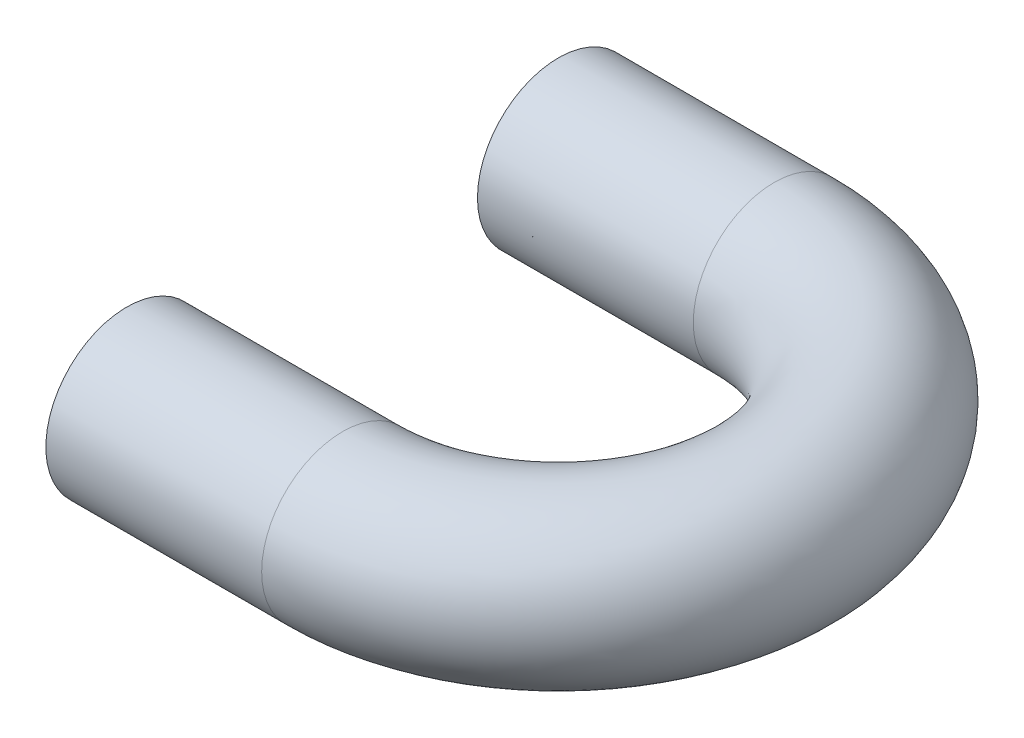
ISO-10303-21;
HEADER;
FILE_DESCRIPTION(('STEP AP214'),'2;1');
FILE_NAME('part.step','',(''),(''),'','','');
FILE_SCHEMA(('AUTOMOTIVE_DESIGN { 1 0 10303 214 1 1 1 1 }'));
ENDSEC;
DATA;
#1=APPLICATION_CONTEXT('core data for automotive mechanical design processes');
#2=APPLICATION_PROTOCOL_DEFINITION('international standard','automotive_design',2000,#1);
#3=PRODUCT_CONTEXT('',#1,'mechanical');
#4=PRODUCT('Part','Part','',(#3));
#5=PRODUCT_RELATED_PRODUCT_CATEGORY('part','',(#4));
#6=PRODUCT_DEFINITION_FORMATION('','',#4);
#7=PRODUCT_DEFINITION_CONTEXT('part definition',#1,'design');
#8=PRODUCT_DEFINITION('design','',#6,#7);
#9=PRODUCT_DEFINITION_SHAPE('','',#8);
#10=(LENGTH_UNIT() NAMED_UNIT(*) SI_UNIT(.MILLI.,.METRE.));
#11=(NAMED_UNIT(*) PLANE_ANGLE_UNIT() SI_UNIT($,.RADIAN.));
#12=(NAMED_UNIT(*) SI_UNIT($,.STERADIAN.) SOLID_ANGLE_UNIT());
#13=UNCERTAINTY_MEASURE_WITH_UNIT(LENGTH_MEASURE(1.E-05),#10,'distance_accuracy_value','');
#14=(GEOMETRIC_REPRESENTATION_CONTEXT(3) GLOBAL_UNCERTAINTY_ASSIGNED_CONTEXT((#13)) GLOBAL_UNIT_ASSIGNED_CONTEXT((#10,
#11,#12)) REPRESENTATION_CONTEXT('',''));
#15=CARTESIAN_POINT('',(0.,0.,0.));
#16=DIRECTION('',(0.,0.,1.));
#17=DIRECTION('',(1.,0.,0.));
#18=AXIS2_PLACEMENT_3D('',#15,#16,#17);
#19=CARTESIAN_POINT('',(0.,0.,0.));
#20=DIRECTION('',(1.,0.,0.));
#21=DIRECTION('',(0.,0.,-1.));
#22=AXIS2_PLACEMENT_3D('',#19,#20,#21);
#23=CYLINDRICAL_SURFACE('',#22,7.5);
#24=CARTESIAN_POINT('',(20.,0.,0.));
#25=DIRECTION('',(1.,0.,0.));
#26=DIRECTION('',(0.,0.,-1.));
#27=AXIS2_PLACEMENT_3D('',#24,#25,#26);
#28=CIRCLE('',#27,7.5);
#29=CARTESIAN_POINT('',(20.,0.,7.5));
#30=VERTEX_POINT('',#29);
#31=EDGE_CURVE('E80',#30,#30,#28,.T.);
#32=ORIENTED_EDGE('',*,*,#31,.F.);
#33=EDGE_LOOP('',(#32));
#34=FACE_BOUND('',#33,.T.);
#35=CARTESIAN_POINT('',(0.,0.,0.));
#36=DIRECTION('',(1.,0.,0.));
#37=DIRECTION('',(0.,0.,-1.));
#38=AXIS2_PLACEMENT_3D('',#35,#36,#37);
#39=CIRCLE('',#38,7.5);
#40=CARTESIAN_POINT('',(0.,0.,-7.5));
#41=VERTEX_POINT('',#40);
#42=EDGE_CURVE('E49',#41,#41,#39,.T.);
#43=ORIENTED_EDGE('',*,*,#42,.T.);
#44=EDGE_LOOP('',(#43));
#45=FACE_BOUND('',#44,.T.);
#46=ADVANCED_FACE('F34',(#34,#45),#23,.T.);
#47=CARTESIAN_POINT('',(20.,0.,-20.));
#48=DIRECTION('',(0.,1.,0.));
#49=DIRECTION('',(0.,0.,1.));
#50=AXIS2_PLACEMENT_3D('',#47,#48,#49);
#51=TOROIDAL_SURFACE('',#50,20.,7.5);
#52=CARTESIAN_POINT('',(20.,0.,-40.));
#53=DIRECTION('',(-1.,0.,0.));
#54=DIRECTION('',(0.,0.,1.));
#55=AXIS2_PLACEMENT_3D('',#52,#53,#54);
#56=CIRCLE('',#55,7.5);
#57=CARTESIAN_POINT('',(20.,0.,-47.5));
#58=VERTEX_POINT('',#57);
#59=EDGE_CURVE('E38',#58,#58,#56,.T.);
#60=CARTESIAN_POINT('',(20.,0.,-20.));
#61=DIRECTION('',(0.,1.,0.));
#62=DIRECTION('',(0.,0.,1.));
#63=AXIS2_PLACEMENT_3D('',#60,#61,#62);
#64=CIRCLE('',#63,27.5);
#65=EDGE_CURVE('',#30,#58,#64,.T.);
#66=ORIENTED_EDGE('',*,*,#31,.T.);
#67=ORIENTED_EDGE('',*,*,#59,.F.);
#68=ORIENTED_EDGE('',*,*,#65,.T.);
#69=ORIENTED_EDGE('',*,*,#65,.F.);
#70=EDGE_LOOP('',(#66,#68,#67,#69));
#71=FACE_BOUND('',#70,.T.);
#72=ADVANCED_FACE('F88',(#71),#51,.T.);
#73=CARTESIAN_POINT('',(20.,0.,-40.));
#74=DIRECTION('',(-1.,0.,0.));
#75=DIRECTION('',(0.,0.,1.));
#76=AXIS2_PLACEMENT_3D('',#73,#74,#75);
#77=CYLINDRICAL_SURFACE('',#76,7.5);
#78=CARTESIAN_POINT('',(0.,0.,-40.));
#79=DIRECTION('',(-1.,0.,0.));
#80=DIRECTION('',(0.,0.,1.));
#81=AXIS2_PLACEMENT_3D('',#78,#79,#80);
#82=CIRCLE('',#81,7.5);
#83=CARTESIAN_POINT('',(0.,0.,-32.5));
#84=VERTEX_POINT('',#83);
#85=EDGE_CURVE('E54',#84,#84,#82,.T.);
#86=ORIENTED_EDGE('',*,*,#85,.F.);
#87=EDGE_LOOP('',(#86));
#88=FACE_BOUND('',#87,.T.);
#89=ORIENTED_EDGE('',*,*,#59,.T.);
#90=EDGE_LOOP('',(#89));
#91=FACE_BOUND('',#90,.T.);
#92=ADVANCED_FACE('F36',(#88,#91),#77,.T.);
#93=CARTESIAN_POINT('',(0.,0.,0.));
#94=DIRECTION('',(1.,0.,0.));
#95=DIRECTION('',(0.,0.,-1.));
#96=AXIS2_PLACEMENT_3D('',#93,#94,#95);
#97=PLANE('',#96);
#98=CARTESIAN_POINT('',(0.,0.,0.));
#99=DIRECTION('',(1.,0.,0.));
#100=DIRECTION('',(0.,0.,-1.));
#101=AXIS2_PLACEMENT_3D('',#98,#99,#100);
#102=CIRCLE('',#101,5.7);
#103=CARTESIAN_POINT('',(0.,0.,-5.7));
#104=VERTEX_POINT('',#103);
#105=EDGE_CURVE('E75',#104,#104,#102,.F.);
#106=ORIENTED_EDGE('',*,*,#105,.F.);
#107=EDGE_LOOP('',(#106));
#108=FACE_BOUND('',#107,.T.);
#109=ORIENTED_EDGE('',*,*,#42,.F.);
#110=EDGE_LOOP('',(#109));
#111=FACE_BOUND('',#110,.T.);
#112=ADVANCED_FACE('F94',(#108,#111),#97,.F.);
#113=CARTESIAN_POINT('',(0.,0.,-40.));
#114=DIRECTION('',(-1.,0.,0.));
#115=DIRECTION('',(0.,0.,1.));
#116=AXIS2_PLACEMENT_3D('',#113,#114,#115);
#117=PLANE('',#116);
#118=CARTESIAN_POINT('',(0.,0.,-40.));
#119=DIRECTION('',(-1.,0.,0.));
#120=DIRECTION('',(0.,0.,1.));
#121=AXIS2_PLACEMENT_3D('',#118,#119,#120);
#122=CIRCLE('',#121,5.7);
#123=CARTESIAN_POINT('',(0.,0.,-34.3));
#124=VERTEX_POINT('',#123);
#125=EDGE_CURVE('E11',#124,#124,#122,.F.);
#126=ORIENTED_EDGE('',*,*,#125,.T.);
#127=EDGE_LOOP('',(#126));
#128=FACE_BOUND('',#127,.T.);
#129=ORIENTED_EDGE('',*,*,#85,.T.);
#130=EDGE_LOOP('',(#129));
#131=FACE_BOUND('',#130,.T.);
#132=ADVANCED_FACE('F61',(#128,#131),#117,.T.);
#133=CARTESIAN_POINT('',(0.,0.,0.));
#134=DIRECTION('',(1.,0.,0.));
#135=DIRECTION('',(0.,0.,-1.));
#136=AXIS2_PLACEMENT_3D('',#133,#134,#135);
#137=CYLINDRICAL_SURFACE('',#136,5.7);
#138=CARTESIAN_POINT('',(20.,0.,0.));
#139=DIRECTION('',(1.,0.,0.));
#140=DIRECTION('',(0.,0.,-1.));
#141=AXIS2_PLACEMENT_3D('',#138,#139,#140);
#142=CIRCLE('',#141,5.7);
#143=CARTESIAN_POINT('',(20.,0.,5.7));
#144=VERTEX_POINT('',#143);
#145=EDGE_CURVE('E72',#144,#144,#142,.F.);
#146=ORIENTED_EDGE('',*,*,#145,.F.);
#147=EDGE_LOOP('',(#146));
#148=FACE_BOUND('',#147,.T.);
#149=ORIENTED_EDGE('',*,*,#105,.T.);
#150=EDGE_LOOP('',(#149));
#151=FACE_BOUND('',#150,.T.);
#152=ADVANCED_FACE('F102',(#148,#151),#137,.F.);
#153=CARTESIAN_POINT('',(20.,0.,-20.));
#154=DIRECTION('',(0.,1.,0.));
#155=DIRECTION('',(0.,0.,1.));
#156=AXIS2_PLACEMENT_3D('',#153,#154,#155);
#157=TOROIDAL_SURFACE('',#156,20.,5.7);
#158=CARTESIAN_POINT('',(20.,0.,-40.));
#159=DIRECTION('',(-1.,0.,0.));
#160=DIRECTION('',(0.,0.,1.));
#161=AXIS2_PLACEMENT_3D('',#158,#159,#160);
#162=CIRCLE('',#161,5.7);
#163=CARTESIAN_POINT('',(20.,0.,-45.7));
#164=VERTEX_POINT('',#163);
#165=EDGE_CURVE('E43',#164,#164,#162,.F.);
#166=CARTESIAN_POINT('',(20.,0.,-20.));
#167=DIRECTION('',(0.,1.,0.));
#168=DIRECTION('',(0.,0.,1.));
#169=AXIS2_PLACEMENT_3D('',#166,#167,#168);
#170=CIRCLE('',#169,25.7);
#171=EDGE_CURVE('',#144,#164,#170,.T.);
#172=ORIENTED_EDGE('',*,*,#145,.T.);
#173=ORIENTED_EDGE('',*,*,#165,.F.);
#174=ORIENTED_EDGE('',*,*,#171,.T.);
#175=ORIENTED_EDGE('',*,*,#171,.F.);
#176=EDGE_LOOP('',(#172,#174,#173,#175));
#177=FACE_BOUND('',#176,.T.);
#178=ADVANCED_FACE('F67',(#177),#157,.F.);
#179=CARTESIAN_POINT('',(20.,0.,-40.));
#180=DIRECTION('',(-1.,0.,0.));
#181=DIRECTION('',(0.,0.,1.));
#182=AXIS2_PLACEMENT_3D('',#179,#180,#181);
#183=CYLINDRICAL_SURFACE('',#182,5.7);
#184=ORIENTED_EDGE('',*,*,#125,.F.);
#185=EDGE_LOOP('',(#184));
#186=FACE_BOUND('',#185,.T.);
#187=ORIENTED_EDGE('',*,*,#165,.T.);
#188=EDGE_LOOP('',(#187));
#189=FACE_BOUND('',#188,.T.);
#190=ADVANCED_FACE('F64',(#186,#189),#183,.F.);
#191=CLOSED_SHELL('',(#46,#72,#92,#112,#132,#152,#178,#190));
#192=MANIFOLD_SOLID_BREP('B2',#191);
#193=ADVANCED_BREP_SHAPE_REPRESENTATION('',(#18,#192),#14);
#194=SHAPE_DEFINITION_REPRESENTATION(#9,#193);
ENDSEC;
END-ISO-10303-21;
